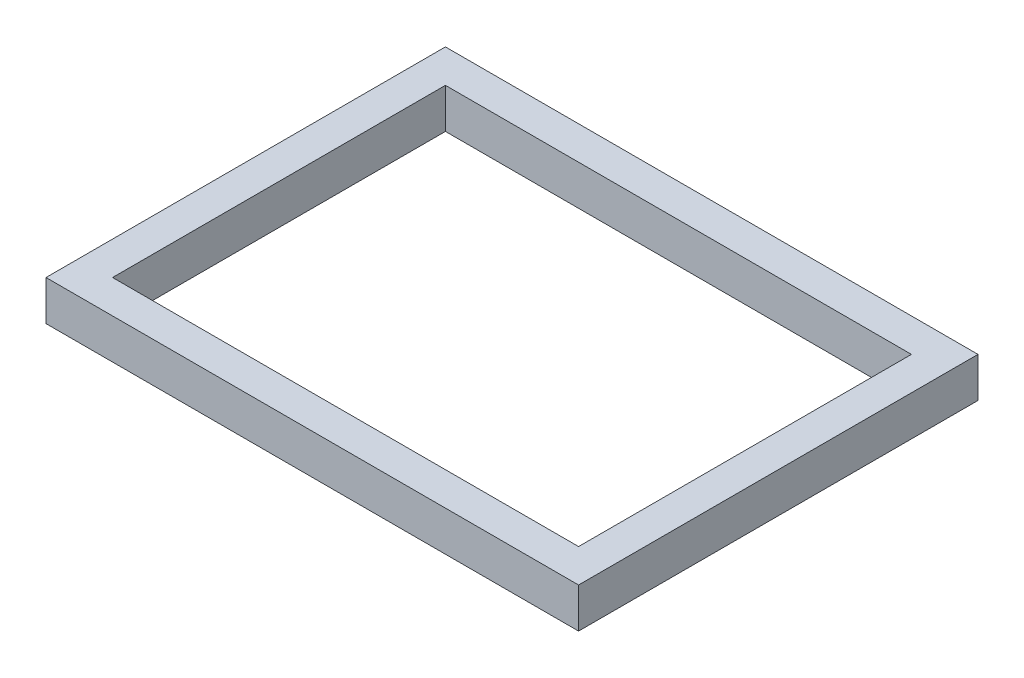
ISO-10303-21;
HEADER;
FILE_DESCRIPTION(('STEP AP214'),'2;1');
FILE_NAME('part.step','',(''),(''),'','','');
FILE_SCHEMA(('AUTOMOTIVE_DESIGN { 1 0 10303 214 1 1 1 1 }'));
ENDSEC;
DATA;
#1=APPLICATION_CONTEXT('core data for automotive mechanical design processes');
#2=APPLICATION_PROTOCOL_DEFINITION('international standard','automotive_design',2000,#1);
#3=PRODUCT_CONTEXT('',#1,'mechanical');
#4=PRODUCT('Part','Part','',(#3));
#5=PRODUCT_RELATED_PRODUCT_CATEGORY('part','',(#4));
#6=PRODUCT_DEFINITION_FORMATION('','',#4);
#7=PRODUCT_DEFINITION_CONTEXT('part definition',#1,'design');
#8=PRODUCT_DEFINITION('design','',#6,#7);
#9=PRODUCT_DEFINITION_SHAPE('','',#8);
#10=(LENGTH_UNIT() NAMED_UNIT(*) SI_UNIT(.MILLI.,.METRE.));
#11=(NAMED_UNIT(*) PLANE_ANGLE_UNIT() SI_UNIT($,.RADIAN.));
#12=(NAMED_UNIT(*) SI_UNIT($,.STERADIAN.) SOLID_ANGLE_UNIT());
#13=UNCERTAINTY_MEASURE_WITH_UNIT(LENGTH_MEASURE(1.E-05),#10,'distance_accuracy_value','');
#14=(GEOMETRIC_REPRESENTATION_CONTEXT(3) GLOBAL_UNCERTAINTY_ASSIGNED_CONTEXT((#13)) GLOBAL_UNIT_ASSIGNED_CONTEXT((#10,
#11,#12)) REPRESENTATION_CONTEXT('',''));
#15=CARTESIAN_POINT('',(0.,0.,0.));
#16=DIRECTION('',(0.,0.,1.));
#17=DIRECTION('',(1.,0.,0.));
#18=AXIS2_PLACEMENT_3D('',#15,#16,#17);
#19=CARTESIAN_POINT('',(0.,6.,0.));
#20=DIRECTION('',(0.,1.,0.));
#21=DIRECTION('',(0.,0.,1.));
#22=AXIS2_PLACEMENT_3D('',#19,#20,#21);
#23=PLANE('',#22);
#24=DIRECTION('',(0.,0.,1.));
#25=VECTOR('',#24,1.);
#26=CARTESIAN_POINT('',(-20.389801168098,6.,-10.9802399463655));
#27=LINE('',#26,#25);
#28=CARTESIAN_POINT('',(-20.389801168098,6.,-10.9802399463655));
#29=VERTEX_POINT('',#28);
#30=CARTESIAN_POINT('',(-20.389801168098,6.,49.0197600536345));
#31=VERTEX_POINT('',#30);
#32=EDGE_CURVE('E136',#29,#31,#27,.T.);
#33=ORIENTED_EDGE('',*,*,#32,.T.);
#34=DIRECTION('',(1.,0.,0.));
#35=VECTOR('',#34,1.);
#36=CARTESIAN_POINT('',(-20.389801168098,6.,49.0197600536345));
#37=LINE('',#36,#35);
#38=CARTESIAN_POINT('',(59.6101988319021,6.,49.0197600536345));
#39=VERTEX_POINT('',#38);
#40=EDGE_CURVE('E139',#31,#39,#37,.T.);
#41=ORIENTED_EDGE('',*,*,#40,.T.);
#42=DIRECTION('',(0.,0.,-1.));
#43=VECTOR('',#42,1.);
#44=CARTESIAN_POINT('',(59.610198831902,6.,-10.9802399463655));
#45=LINE('',#44,#43);
#46=CARTESIAN_POINT('',(59.610198831902,6.,-10.9802399463655));
#47=VERTEX_POINT('',#46);
#48=EDGE_CURVE('E142',#39,#47,#45,.T.);
#49=ORIENTED_EDGE('',*,*,#48,.T.);
#50=DIRECTION('',(-1.,0.,0.));
#51=VECTOR('',#50,1.);
#52=CARTESIAN_POINT('',(-20.389801168098,6.,-10.9802399463655));
#53=LINE('',#52,#51);
#54=EDGE_CURVE('E144',#47,#29,#53,.T.);
#55=ORIENTED_EDGE('',*,*,#54,.T.);
#56=EDGE_LOOP('',(#33,#41,#49,#55));
#57=FACE_BOUND('',#56,.T.);
#58=DIRECTION('',(-1.,0.,0.));
#59=VECTOR('',#58,1.);
#60=CARTESIAN_POINT('',(-15.389801168098,6.,-5.98023994636552));
#61=LINE('',#60,#59);
#62=CARTESIAN_POINT('',(54.610198831902,6.,-5.98023994636552));
#63=VERTEX_POINT('',#62);
#64=CARTESIAN_POINT('',(-15.389801168098,6.,-5.98023994636552));
#65=VERTEX_POINT('',#64);
#66=EDGE_CURVE('E108',#63,#65,#61,.T.);
#67=ORIENTED_EDGE('',*,*,#66,.F.);
#68=DIRECTION('',(0.,0.,-1.));
#69=VECTOR('',#68,1.);
#70=CARTESIAN_POINT('',(54.610198831902,6.,-5.98023994636552));
#71=LINE('',#70,#69);
#72=CARTESIAN_POINT('',(54.6101988319021,6.,44.0197600536345));
#73=VERTEX_POINT('',#72);
#74=EDGE_CURVE('E100',#73,#63,#71,.T.);
#75=ORIENTED_EDGE('',*,*,#74,.F.);
#76=DIRECTION('',(1.,0.,0.));
#77=VECTOR('',#76,1.);
#78=CARTESIAN_POINT('',(-15.389801168098,6.,44.0197600536345));
#79=LINE('',#78,#77);
#80=CARTESIAN_POINT('',(-15.389801168098,6.,44.0197600536345));
#81=VERTEX_POINT('',#80);
#82=EDGE_CURVE('E122',#81,#73,#79,.T.);
#83=ORIENTED_EDGE('',*,*,#82,.F.);
#84=DIRECTION('',(0.,0.,1.));
#85=VECTOR('',#84,1.);
#86=CARTESIAN_POINT('',(-15.389801168098,6.,-5.98023994636552));
#87=LINE('',#86,#85);
#88=EDGE_CURVE('E120',#65,#81,#87,.T.);
#89=ORIENTED_EDGE('',*,*,#88,.F.);
#90=EDGE_LOOP('',(#67,#75,#83,#89));
#91=FACE_BOUND('',#90,.T.);
#92=ADVANCED_FACE('F35',(#57,#91),#23,.T.);
#93=CARTESIAN_POINT('',(0.,0.,0.));
#94=DIRECTION('',(0.,1.,0.));
#95=DIRECTION('',(0.,0.,1.));
#96=AXIS2_PLACEMENT_3D('',#93,#94,#95);
#97=PLANE('',#96);
#98=DIRECTION('',(0.,0.,1.));
#99=VECTOR('',#98,1.);
#100=CARTESIAN_POINT('',(-20.389801168098,0.,-10.9802399463655));
#101=LINE('',#100,#99);
#102=CARTESIAN_POINT('',(-20.389801168098,0.,-10.9802399463655));
#103=VERTEX_POINT('',#102);
#104=CARTESIAN_POINT('',(-20.389801168098,0.,49.0197600536345));
#105=VERTEX_POINT('',#104);
#106=EDGE_CURVE('E116',#103,#105,#101,.T.);
#107=ORIENTED_EDGE('',*,*,#106,.F.);
#108=DIRECTION('',(-1.,0.,0.));
#109=VECTOR('',#108,1.);
#110=CARTESIAN_POINT('',(-20.389801168098,0.,-10.9802399463655));
#111=LINE('',#110,#109);
#112=CARTESIAN_POINT('',(59.610198831902,0.,-10.9802399463655));
#113=VERTEX_POINT('',#112);
#114=EDGE_CURVE('E140',#113,#103,#111,.T.);
#115=ORIENTED_EDGE('',*,*,#114,.F.);
#116=DIRECTION('',(0.,0.,-1.));
#117=VECTOR('',#116,1.);
#118=CARTESIAN_POINT('',(59.610198831902,0.,-10.9802399463655));
#119=LINE('',#118,#117);
#120=CARTESIAN_POINT('',(59.6101988319021,0.,49.0197600536345));
#121=VERTEX_POINT('',#120);
#122=EDGE_CURVE('E151',#121,#113,#119,.T.);
#123=ORIENTED_EDGE('',*,*,#122,.F.);
#124=DIRECTION('',(1.,0.,0.));
#125=VECTOR('',#124,1.);
#126=CARTESIAN_POINT('',(-20.389801168098,0.,49.0197600536345));
#127=LINE('',#126,#125);
#128=EDGE_CURVE('E149',#105,#121,#127,.T.);
#129=ORIENTED_EDGE('',*,*,#128,.F.);
#130=EDGE_LOOP('',(#107,#115,#123,#129));
#131=FACE_BOUND('',#130,.T.);
#132=DIRECTION('',(0.,0.,-1.));
#133=VECTOR('',#132,1.);
#134=CARTESIAN_POINT('',(54.610198831902,0.,-5.98023994636552));
#135=LINE('',#134,#133);
#136=CARTESIAN_POINT('',(54.6101988319021,0.,44.0197600536345));
#137=VERTEX_POINT('',#136);
#138=CARTESIAN_POINT('',(54.610198831902,0.,-5.98023994636552));
#139=VERTEX_POINT('',#138);
#140=EDGE_CURVE('E58',#137,#139,#135,.T.);
#141=ORIENTED_EDGE('',*,*,#140,.T.);
#142=DIRECTION('',(-1.,0.,0.));
#143=VECTOR('',#142,1.);
#144=CARTESIAN_POINT('',(-15.389801168098,0.,-5.98023994636552));
#145=LINE('',#144,#143);
#146=CARTESIAN_POINT('',(-15.389801168098,0.,-5.98023994636552));
#147=VERTEX_POINT('',#146);
#148=EDGE_CURVE('E115',#139,#147,#145,.T.);
#149=ORIENTED_EDGE('',*,*,#148,.T.);
#150=DIRECTION('',(0.,0.,1.));
#151=VECTOR('',#150,1.);
#152=CARTESIAN_POINT('',(-15.389801168098,0.,-5.98023994636552));
#153=LINE('',#152,#151);
#154=CARTESIAN_POINT('',(-15.389801168098,0.,44.0197600536345));
#155=VERTEX_POINT('',#154);
#156=EDGE_CURVE('E128',#147,#155,#153,.T.);
#157=ORIENTED_EDGE('',*,*,#156,.T.);
#158=DIRECTION('',(1.,0.,0.));
#159=VECTOR('',#158,1.);
#160=CARTESIAN_POINT('',(-15.389801168098,0.,44.0197600536345));
#161=LINE('',#160,#159);
#162=EDGE_CURVE('E109',#155,#137,#161,.T.);
#163=ORIENTED_EDGE('',*,*,#162,.T.);
#164=EDGE_LOOP('',(#141,#149,#157,#163));
#165=FACE_BOUND('',#164,.T.);
#166=ADVANCED_FACE('F169',(#131,#165),#97,.F.);
#167=CARTESIAN_POINT('',(-20.389801168098,6.,-10.9802399463655));
#168=DIRECTION('',(1.,0.,0.));
#169=DIRECTION('',(0.,0.,-1.));
#170=AXIS2_PLACEMENT_3D('',#167,#168,#169);
#171=PLANE('',#170);
#172=ORIENTED_EDGE('',*,*,#106,.T.);
#173=DIRECTION('',(0.,-1.,0.));
#174=VECTOR('',#173,1.);
#175=CARTESIAN_POINT('',(-20.389801168098,6.,49.0197600536345));
#176=LINE('',#175,#174);
#177=EDGE_CURVE('E11',#31,#105,#176,.T.);
#178=ORIENTED_EDGE('',*,*,#177,.F.);
#179=ORIENTED_EDGE('',*,*,#32,.F.);
#180=DIRECTION('',(0.,-1.,0.));
#181=VECTOR('',#180,1.);
#182=CARTESIAN_POINT('',(-20.389801168098,6.,-10.9802399463655));
#183=LINE('',#182,#181);
#184=EDGE_CURVE('E146',#29,#103,#183,.T.);
#185=ORIENTED_EDGE('',*,*,#184,.T.);
#186=EDGE_LOOP('',(#172,#178,#179,#185));
#187=FACE_BOUND('',#186,.T.);
#188=ADVANCED_FACE('F37',(#187),#171,.F.);
#189=CARTESIAN_POINT('',(-20.389801168098,6.,49.0197600536345));
#190=DIRECTION('',(0.,0.,-1.));
#191=DIRECTION('',(-1.,0.,0.));
#192=AXIS2_PLACEMENT_3D('',#189,#190,#191);
#193=PLANE('',#192);
#194=ORIENTED_EDGE('',*,*,#128,.T.);
#195=DIRECTION('',(0.,-1.,0.));
#196=VECTOR('',#195,1.);
#197=CARTESIAN_POINT('',(59.6101988319021,6.,49.0197600536345));
#198=LINE('',#197,#196);
#199=EDGE_CURVE('E43',#39,#121,#198,.T.);
#200=ORIENTED_EDGE('',*,*,#199,.F.);
#201=ORIENTED_EDGE('',*,*,#40,.F.);
#202=ORIENTED_EDGE('',*,*,#177,.T.);
#203=EDGE_LOOP('',(#194,#200,#201,#202));
#204=FACE_BOUND('',#203,.T.);
#205=ADVANCED_FACE('F179',(#204),#193,.F.);
#206=CARTESIAN_POINT('',(59.610198831902,6.,-10.9802399463655));
#207=DIRECTION('',(-1.,0.,0.));
#208=DIRECTION('',(0.,0.,1.));
#209=AXIS2_PLACEMENT_3D('',#206,#207,#208);
#210=PLANE('',#209);
#211=ORIENTED_EDGE('',*,*,#122,.T.);
#212=DIRECTION('',(0.,-1.,0.));
#213=VECTOR('',#212,1.);
#214=CARTESIAN_POINT('',(59.610198831902,6.,-10.9802399463655));
#215=LINE('',#214,#213);
#216=EDGE_CURVE('E156',#47,#113,#215,.T.);
#217=ORIENTED_EDGE('',*,*,#216,.F.);
#218=ORIENTED_EDGE('',*,*,#48,.F.);
#219=ORIENTED_EDGE('',*,*,#199,.T.);
#220=EDGE_LOOP('',(#211,#217,#218,#219));
#221=FACE_BOUND('',#220,.T.);
#222=ADVANCED_FACE('F163',(#221),#210,.F.);
#223=CARTESIAN_POINT('',(-20.389801168098,6.,-10.9802399463655));
#224=DIRECTION('',(0.,0.,1.));
#225=DIRECTION('',(1.,0.,0.));
#226=AXIS2_PLACEMENT_3D('',#223,#224,#225);
#227=PLANE('',#226);
#228=ORIENTED_EDGE('',*,*,#114,.T.);
#229=ORIENTED_EDGE('',*,*,#184,.F.);
#230=ORIENTED_EDGE('',*,*,#54,.F.);
#231=ORIENTED_EDGE('',*,*,#216,.T.);
#232=EDGE_LOOP('',(#228,#229,#230,#231));
#233=FACE_BOUND('',#232,.T.);
#234=ADVANCED_FACE('F173',(#233),#227,.F.);
#235=CARTESIAN_POINT('',(54.610198831902,6.,-5.98023994636552));
#236=DIRECTION('',(-1.,0.,0.));
#237=DIRECTION('',(0.,0.,1.));
#238=AXIS2_PLACEMENT_3D('',#235,#236,#237);
#239=PLANE('',#238);
#240=ORIENTED_EDGE('',*,*,#140,.F.);
#241=DIRECTION('',(0.,-1.,0.));
#242=VECTOR('',#241,1.);
#243=CARTESIAN_POINT('',(54.6101988319021,6.,44.0197600536345));
#244=LINE('',#243,#242);
#245=EDGE_CURVE('E104',#73,#137,#244,.T.);
#246=ORIENTED_EDGE('',*,*,#245,.F.);
#247=ORIENTED_EDGE('',*,*,#74,.T.);
#248=DIRECTION('',(0.,-1.,0.));
#249=VECTOR('',#248,1.);
#250=CARTESIAN_POINT('',(54.610198831902,6.,-5.98023994636552));
#251=LINE('',#250,#249);
#252=EDGE_CURVE('E103',#63,#139,#251,.T.);
#253=ORIENTED_EDGE('',*,*,#252,.T.);
#254=EDGE_LOOP('',(#240,#246,#247,#253));
#255=FACE_BOUND('',#254,.T.);
#256=ADVANCED_FACE('F102',(#255),#239,.T.);
#257=CARTESIAN_POINT('',(-15.389801168098,6.,-5.98023994636552));
#258=DIRECTION('',(0.,0.,1.));
#259=DIRECTION('',(1.,0.,0.));
#260=AXIS2_PLACEMENT_3D('',#257,#258,#259);
#261=PLANE('',#260);
#262=ORIENTED_EDGE('',*,*,#148,.F.);
#263=ORIENTED_EDGE('',*,*,#252,.F.);
#264=ORIENTED_EDGE('',*,*,#66,.T.);
#265=DIRECTION('',(0.,-1.,0.));
#266=VECTOR('',#265,1.);
#267=CARTESIAN_POINT('',(-15.389801168098,6.,-5.98023994636552));
#268=LINE('',#267,#266);
#269=EDGE_CURVE('E117',#65,#147,#268,.T.);
#270=ORIENTED_EDGE('',*,*,#269,.T.);
#271=EDGE_LOOP('',(#262,#263,#264,#270));
#272=FACE_BOUND('',#271,.T.);
#273=ADVANCED_FACE('F112',(#272),#261,.T.);
#274=CARTESIAN_POINT('',(-15.389801168098,6.,-5.98023994636552));
#275=DIRECTION('',(1.,0.,0.));
#276=DIRECTION('',(0.,0.,-1.));
#277=AXIS2_PLACEMENT_3D('',#274,#275,#276);
#278=PLANE('',#277);
#279=ORIENTED_EDGE('',*,*,#156,.F.);
#280=ORIENTED_EDGE('',*,*,#269,.F.);
#281=ORIENTED_EDGE('',*,*,#88,.T.);
#282=DIRECTION('',(0.,-1.,0.));
#283=VECTOR('',#282,1.);
#284=CARTESIAN_POINT('',(-15.389801168098,6.,44.0197600536345));
#285=LINE('',#284,#283);
#286=EDGE_CURVE('E50',#81,#155,#285,.T.);
#287=ORIENTED_EDGE('',*,*,#286,.T.);
#288=EDGE_LOOP('',(#279,#280,#281,#287));
#289=FACE_BOUND('',#288,.T.);
#290=ADVANCED_FACE('F202',(#289),#278,.T.);
#291=CARTESIAN_POINT('',(-15.389801168098,6.,44.0197600536345));
#292=DIRECTION('',(0.,0.,-1.));
#293=DIRECTION('',(-1.,0.,0.));
#294=AXIS2_PLACEMENT_3D('',#291,#292,#293);
#295=PLANE('',#294);
#296=ORIENTED_EDGE('',*,*,#162,.F.);
#297=ORIENTED_EDGE('',*,*,#286,.F.);
#298=ORIENTED_EDGE('',*,*,#82,.T.);
#299=ORIENTED_EDGE('',*,*,#245,.T.);
#300=EDGE_LOOP('',(#296,#297,#298,#299));
#301=FACE_BOUND('',#300,.T.);
#302=ADVANCED_FACE('F206',(#301),#295,.T.);
#303=CLOSED_SHELL('',(#92,#166,#188,#205,#222,#234,#256,#273,#290,#302));
#304=MANIFOLD_SOLID_BREP('B2',#303);
#305=ADVANCED_BREP_SHAPE_REPRESENTATION('',(#18,#304),#14);
#306=SHAPE_DEFINITION_REPRESENTATION(#9,#305);
ENDSEC;
END-ISO-10303-21;
